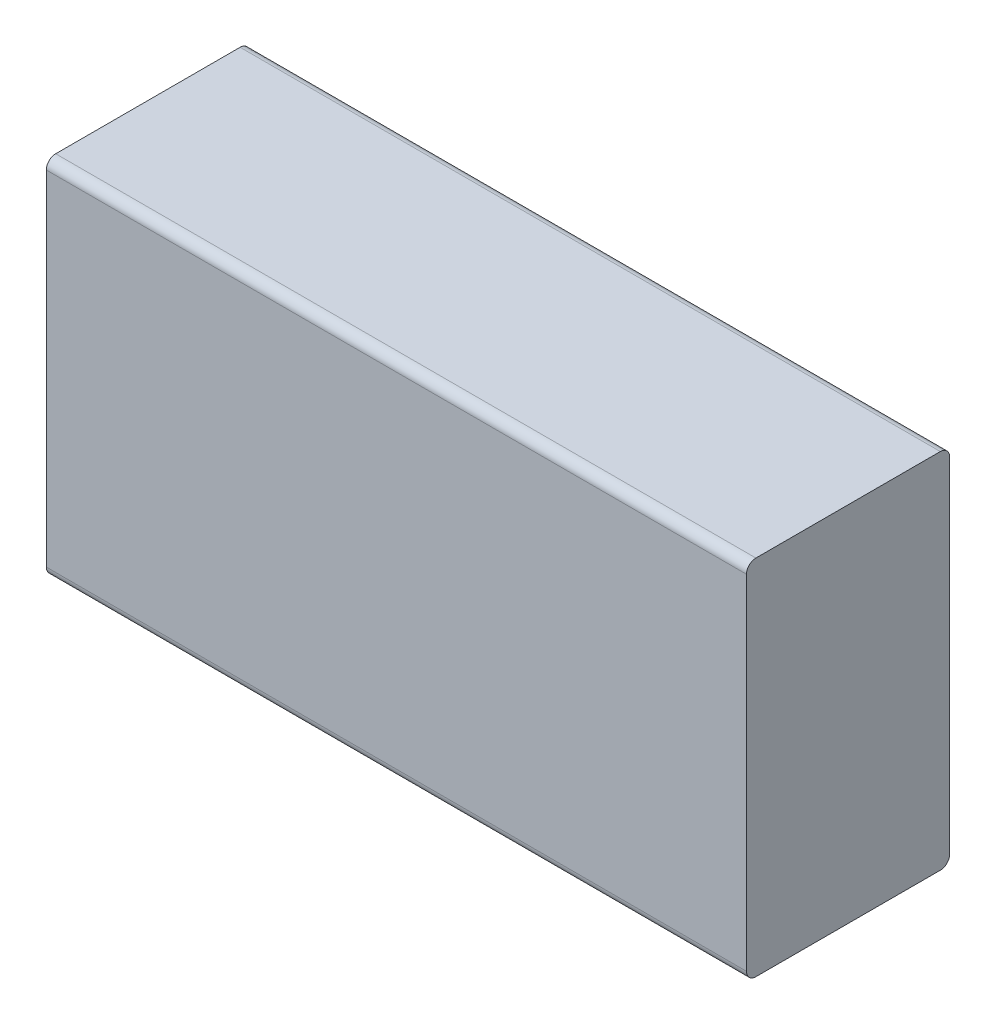
ISO-10303-21;
HEADER;
FILE_DESCRIPTION(('STEP AP214'),'2;1');
FILE_NAME('part.step','',(''),(''),'','','');
FILE_SCHEMA(('AUTOMOTIVE_DESIGN { 1 0 10303 214 1 1 1 1 }'));
ENDSEC;
DATA;
#1=APPLICATION_CONTEXT('core data for automotive mechanical design processes');
#2=APPLICATION_PROTOCOL_DEFINITION('international standard','automotive_design',2000,#1);
#3=PRODUCT_CONTEXT('',#1,'mechanical');
#4=PRODUCT('Part','Part','',(#3));
#5=PRODUCT_RELATED_PRODUCT_CATEGORY('part','',(#4));
#6=PRODUCT_DEFINITION_FORMATION('','',#4);
#7=PRODUCT_DEFINITION_CONTEXT('part definition',#1,'design');
#8=PRODUCT_DEFINITION('design','',#6,#7);
#9=PRODUCT_DEFINITION_SHAPE('','',#8);
#10=(LENGTH_UNIT() NAMED_UNIT(*) SI_UNIT(.MILLI.,.METRE.));
#11=(NAMED_UNIT(*) PLANE_ANGLE_UNIT() SI_UNIT($,.RADIAN.));
#12=(NAMED_UNIT(*) SI_UNIT($,.STERADIAN.) SOLID_ANGLE_UNIT());
#13=UNCERTAINTY_MEASURE_WITH_UNIT(LENGTH_MEASURE(1.E-05),#10,'distance_accuracy_value','');
#14=(GEOMETRIC_REPRESENTATION_CONTEXT(3) GLOBAL_UNCERTAINTY_ASSIGNED_CONTEXT((#13)) GLOBAL_UNIT_ASSIGNED_CONTEXT((#10,
#11,#12)) REPRESENTATION_CONTEXT('',''));
#15=CARTESIAN_POINT('',(0.,0.,0.));
#16=DIRECTION('',(0.,0.,1.));
#17=DIRECTION('',(1.,0.,0.));
#18=AXIS2_PLACEMENT_3D('',#15,#16,#17);
#19=CARTESIAN_POINT('',(168.,3.,29.5));
#20=DIRECTION('',(-1.,0.,0.));
#21=DIRECTION('',(0.,0.,1.));
#22=AXIS2_PLACEMENT_3D('',#19,#20,#21);
#23=CYLINDRICAL_SURFACE('',#22,3.);
#24=CARTESIAN_POINT('',(224.,3.,29.5));
#25=DIRECTION('',(-1.,0.,0.));
#26=DIRECTION('',(0.,0.,1.));
#27=AXIS2_PLACEMENT_3D('',#24,#25,#26);
#28=CIRCLE('',#27,3.);
#29=CARTESIAN_POINT('',(224.,3.00000000000001,32.5));
#30=VERTEX_POINT('',#29);
#31=CARTESIAN_POINT('',(224.,0.,29.5));
#32=VERTEX_POINT('',#31);
#33=EDGE_CURVE('E104',#30,#32,#28,.F.);
#34=ORIENTED_EDGE('',*,*,#33,.F.);
#35=DIRECTION('',(1.,0.,0.));
#36=VECTOR('',#35,1.);
#37=CARTESIAN_POINT('',(112.,3.00000000000001,32.5));
#38=LINE('',#37,#36);
#39=CARTESIAN_POINT('',(0.,3.,32.5));
#40=VERTEX_POINT('',#39);
#41=EDGE_CURVE('E93',#40,#30,#38,.T.);
#42=ORIENTED_EDGE('',*,*,#41,.F.);
#43=CARTESIAN_POINT('',(0.,3.,29.5));
#44=DIRECTION('',(-1.,0.,0.));
#45=DIRECTION('',(0.,0.,1.));
#46=AXIS2_PLACEMENT_3D('',#43,#44,#45);
#47=CIRCLE('',#46,3.);
#48=CARTESIAN_POINT('',(0.,0.,29.5));
#49=VERTEX_POINT('',#48);
#50=EDGE_CURVE('E130',#49,#40,#47,.T.);
#51=ORIENTED_EDGE('',*,*,#50,.F.);
#52=DIRECTION('',(1.,0.,0.));
#53=VECTOR('',#52,1.);
#54=CARTESIAN_POINT('',(224.,0.,29.5));
#55=LINE('',#54,#53);
#56=EDGE_CURVE('E111',#32,#49,#55,.F.);
#57=ORIENTED_EDGE('',*,*,#56,.F.);
#58=EDGE_LOOP('',(#34,#42,#51,#57));
#59=FACE_BOUND('',#58,.T.);
#60=ADVANCED_FACE('F17',(#59),#23,.T.);
#61=CARTESIAN_POINT('',(112.,58.,32.5));
#62=DIRECTION('',(0.,0.,1.));
#63=DIRECTION('',(1.,0.,0.));
#64=AXIS2_PLACEMENT_3D('',#61,#62,#63);
#65=PLANE('',#64);
#66=ORIENTED_EDGE('',*,*,#41,.T.);
#67=DIRECTION('',(0.,1.,0.));
#68=VECTOR('',#67,1.);
#69=CARTESIAN_POINT('',(224.,116.,32.5));
#70=LINE('',#69,#68);
#71=CARTESIAN_POINT('',(224.,113.,32.5));
#72=VERTEX_POINT('',#71);
#73=EDGE_CURVE('E98',#72,#30,#70,.F.);
#74=ORIENTED_EDGE('',*,*,#73,.F.);
#75=DIRECTION('',(1.,0.,0.));
#76=VECTOR('',#75,1.);
#77=CARTESIAN_POINT('',(56.,113.,32.5));
#78=LINE('',#77,#76);
#79=CARTESIAN_POINT('',(0.,113.,32.5));
#80=VERTEX_POINT('',#79);
#81=EDGE_CURVE('E86',#80,#72,#78,.T.);
#82=ORIENTED_EDGE('',*,*,#81,.F.);
#83=DIRECTION('',(0.,1.,0.));
#84=VECTOR('',#83,1.);
#85=CARTESIAN_POINT('',(0.,0.,32.5));
#86=LINE('',#85,#84);
#87=EDGE_CURVE('E129',#40,#80,#86,.T.);
#88=ORIENTED_EDGE('',*,*,#87,.F.);
#89=EDGE_LOOP('',(#66,#74,#82,#88));
#90=FACE_BOUND('',#89,.T.);
#91=ADVANCED_FACE('F102',(#90),#65,.T.);
#92=CARTESIAN_POINT('',(56.,113.,29.5));
#93=DIRECTION('',(1.,0.,0.));
#94=DIRECTION('',(0.,1.,0.));
#95=AXIS2_PLACEMENT_3D('',#92,#93,#94);
#96=CYLINDRICAL_SURFACE('',#95,3.);
#97=CARTESIAN_POINT('',(0.,113.,29.5));
#98=DIRECTION('',(1.,0.,0.));
#99=DIRECTION('',(0.,1.,0.));
#100=AXIS2_PLACEMENT_3D('',#97,#98,#99);
#101=CIRCLE('',#100,3.);
#102=CARTESIAN_POINT('',(0.,116.,29.5));
#103=VERTEX_POINT('',#102);
#104=EDGE_CURVE('E89',#80,#103,#101,.F.);
#105=ORIENTED_EDGE('',*,*,#104,.F.);
#106=ORIENTED_EDGE('',*,*,#81,.T.);
#107=CARTESIAN_POINT('',(224.,113.,29.5));
#108=DIRECTION('',(1.,0.,0.));
#109=DIRECTION('',(0.,1.,0.));
#110=AXIS2_PLACEMENT_3D('',#107,#108,#109);
#111=CIRCLE('',#110,3.);
#112=CARTESIAN_POINT('',(224.,116.,29.5));
#113=VERTEX_POINT('',#112);
#114=EDGE_CURVE('E20',#113,#72,#111,.T.);
#115=ORIENTED_EDGE('',*,*,#114,.F.);
#116=DIRECTION('',(1.,0.,0.));
#117=VECTOR('',#116,1.);
#118=CARTESIAN_POINT('',(0.,116.,29.5));
#119=LINE('',#118,#117);
#120=EDGE_CURVE('E79',#103,#113,#119,.T.);
#121=ORIENTED_EDGE('',*,*,#120,.F.);
#122=EDGE_LOOP('',(#105,#106,#115,#121));
#123=FACE_BOUND('',#122,.T.);
#124=ADVANCED_FACE('F88',(#123),#96,.T.);
#125=CARTESIAN_POINT('',(0.,116.,0.));
#126=DIRECTION('',(0.,1.,0.));
#127=DIRECTION('',(0.,0.,1.));
#128=AXIS2_PLACEMENT_3D('',#125,#126,#127);
#129=PLANE('',#128);
#130=ORIENTED_EDGE('',*,*,#120,.T.);
#131=DIRECTION('',(0.,0.,-1.));
#132=VECTOR('',#131,1.);
#133=CARTESIAN_POINT('',(224.,116.,0.));
#134=LINE('',#133,#132);
#135=CARTESIAN_POINT('',(224.,116.,-29.5));
#136=VERTEX_POINT('',#135);
#137=EDGE_CURVE('E101',#136,#113,#134,.F.);
#138=ORIENTED_EDGE('',*,*,#137,.F.);
#139=DIRECTION('',(-1.,0.,0.));
#140=VECTOR('',#139,1.);
#141=CARTESIAN_POINT('',(56.,116.,-29.5));
#142=LINE('',#141,#140);
#143=CARTESIAN_POINT('',(0.,116.,-29.5));
#144=VERTEX_POINT('',#143);
#145=EDGE_CURVE('E115',#144,#136,#142,.F.);
#146=ORIENTED_EDGE('',*,*,#145,.F.);
#147=DIRECTION('',(0.,0.,1.));
#148=VECTOR('',#147,1.);
#149=CARTESIAN_POINT('',(0.,116.,0.));
#150=LINE('',#149,#148);
#151=EDGE_CURVE('E127',#103,#144,#150,.F.);
#152=ORIENTED_EDGE('',*,*,#151,.F.);
#153=EDGE_LOOP('',(#130,#138,#146,#152));
#154=FACE_BOUND('',#153,.T.);
#155=ADVANCED_FACE('F156',(#154),#129,.T.);
#156=CARTESIAN_POINT('',(224.,0.,0.));
#157=DIRECTION('',(0.,-1.,0.));
#158=DIRECTION('',(0.,0.,-1.));
#159=AXIS2_PLACEMENT_3D('',#156,#157,#158);
#160=PLANE('',#159);
#161=ORIENTED_EDGE('',*,*,#56,.T.);
#162=DIRECTION('',(0.,0.,1.));
#163=VECTOR('',#162,1.);
#164=CARTESIAN_POINT('',(0.,0.,0.));
#165=LINE('',#164,#163);
#166=CARTESIAN_POINT('',(0.,0.,-29.5));
#167=VERTEX_POINT('',#166);
#168=EDGE_CURVE('E132',#167,#49,#165,.T.);
#169=ORIENTED_EDGE('',*,*,#168,.F.);
#170=DIRECTION('',(1.,0.,0.));
#171=VECTOR('',#170,1.);
#172=CARTESIAN_POINT('',(168.,0.,-29.5));
#173=LINE('',#172,#171);
#174=CARTESIAN_POINT('',(224.,0.,-29.5));
#175=VERTEX_POINT('',#174);
#176=EDGE_CURVE('E112',#175,#167,#173,.F.);
#177=ORIENTED_EDGE('',*,*,#176,.F.);
#178=DIRECTION('',(0.,0.,-1.));
#179=VECTOR('',#178,1.);
#180=CARTESIAN_POINT('',(224.,0.,0.));
#181=LINE('',#180,#179);
#182=EDGE_CURVE('E106',#32,#175,#181,.T.);
#183=ORIENTED_EDGE('',*,*,#182,.F.);
#184=EDGE_LOOP('',(#161,#169,#177,#183));
#185=FACE_BOUND('',#184,.T.);
#186=ADVANCED_FACE('F158',(#185),#160,.T.);
#187=CARTESIAN_POINT('',(224.,116.,0.));
#188=DIRECTION('',(1.,0.,0.));
#189=DIRECTION('',(0.,0.,-1.));
#190=AXIS2_PLACEMENT_3D('',#187,#188,#189);
#191=PLANE('',#190);
#192=ORIENTED_EDGE('',*,*,#33,.T.);
#193=ORIENTED_EDGE('',*,*,#182,.T.);
#194=CARTESIAN_POINT('',(224.,3.,-29.5));
#195=DIRECTION('',(1.,0.,0.));
#196=DIRECTION('',(0.,0.,-1.));
#197=AXIS2_PLACEMENT_3D('',#194,#195,#196);
#198=CIRCLE('',#197,3.);
#199=CARTESIAN_POINT('',(224.,3.,-32.5));
#200=VERTEX_POINT('',#199);
#201=EDGE_CURVE('E114',#200,#175,#198,.F.);
#202=ORIENTED_EDGE('',*,*,#201,.F.);
#203=DIRECTION('',(0.,1.,0.));
#204=VECTOR('',#203,1.);
#205=CARTESIAN_POINT('',(224.,58.,-32.5));
#206=LINE('',#205,#204);
#207=CARTESIAN_POINT('',(224.,113.,-32.5));
#208=VERTEX_POINT('',#207);
#209=EDGE_CURVE('E122',#200,#208,#206,.T.);
#210=ORIENTED_EDGE('',*,*,#209,.T.);
#211=CARTESIAN_POINT('',(224.,113.,-29.5));
#212=DIRECTION('',(-1.,0.,0.));
#213=DIRECTION('',(0.,-1.,0.));
#214=AXIS2_PLACEMENT_3D('',#211,#212,#213);
#215=CIRCLE('',#214,3.);
#216=EDGE_CURVE('E117',#136,#208,#215,.T.);
#217=ORIENTED_EDGE('',*,*,#216,.F.);
#218=ORIENTED_EDGE('',*,*,#137,.T.);
#219=ORIENTED_EDGE('',*,*,#114,.T.);
#220=ORIENTED_EDGE('',*,*,#73,.T.);
#221=EDGE_LOOP('',(#192,#193,#202,#210,#217,#218,#219,#220));
#222=FACE_BOUND('',#221,.T.);
#223=ADVANCED_FACE('F97',(#222),#191,.T.);
#224=CARTESIAN_POINT('',(56.,113.,-29.5));
#225=DIRECTION('',(-1.,0.,0.));
#226=DIRECTION('',(0.,-1.,0.));
#227=AXIS2_PLACEMENT_3D('',#224,#225,#226);
#228=CYLINDRICAL_SURFACE('',#227,3.);
#229=ORIENTED_EDGE('',*,*,#216,.T.);
#230=DIRECTION('',(1.,0.,0.));
#231=VECTOR('',#230,1.);
#232=CARTESIAN_POINT('',(112.,113.,-32.5));
#233=LINE('',#232,#231);
#234=CARTESIAN_POINT('',(0.,113.,-32.5));
#235=VERTEX_POINT('',#234);
#236=EDGE_CURVE('E144',#208,#235,#233,.F.);
#237=ORIENTED_EDGE('',*,*,#236,.T.);
#238=CARTESIAN_POINT('',(0.,113.,-29.5));
#239=DIRECTION('',(-1.,0.,0.));
#240=DIRECTION('',(0.,-1.,0.));
#241=AXIS2_PLACEMENT_3D('',#238,#239,#240);
#242=CIRCLE('',#241,3.);
#243=EDGE_CURVE('E125',#144,#235,#242,.T.);
#244=ORIENTED_EDGE('',*,*,#243,.F.);
#245=ORIENTED_EDGE('',*,*,#145,.T.);
#246=EDGE_LOOP('',(#229,#237,#244,#245));
#247=FACE_BOUND('',#246,.T.);
#248=ADVANCED_FACE('F153',(#247),#228,.T.);
#249=CARTESIAN_POINT('',(0.,0.,0.));
#250=DIRECTION('',(-1.,0.,0.));
#251=DIRECTION('',(0.,0.,1.));
#252=AXIS2_PLACEMENT_3D('',#249,#250,#251);
#253=PLANE('',#252);
#254=ORIENTED_EDGE('',*,*,#243,.T.);
#255=DIRECTION('',(0.,1.,0.));
#256=VECTOR('',#255,1.);
#257=CARTESIAN_POINT('',(0.,58.,-32.5));
#258=LINE('',#257,#256);
#259=CARTESIAN_POINT('',(0.,3.,-32.5));
#260=VERTEX_POINT('',#259);
#261=EDGE_CURVE('E26',#235,#260,#258,.F.);
#262=ORIENTED_EDGE('',*,*,#261,.T.);
#263=CARTESIAN_POINT('',(0.,3.,-29.5));
#264=DIRECTION('',(1.,0.,0.));
#265=DIRECTION('',(0.,0.,-1.));
#266=AXIS2_PLACEMENT_3D('',#263,#264,#265);
#267=CIRCLE('',#266,3.);
#268=EDGE_CURVE('E34',#167,#260,#267,.T.);
#269=ORIENTED_EDGE('',*,*,#268,.F.);
#270=ORIENTED_EDGE('',*,*,#168,.T.);
#271=ORIENTED_EDGE('',*,*,#50,.T.);
#272=ORIENTED_EDGE('',*,*,#87,.T.);
#273=ORIENTED_EDGE('',*,*,#104,.T.);
#274=ORIENTED_EDGE('',*,*,#151,.T.);
#275=EDGE_LOOP('',(#254,#262,#269,#270,#271,#272,#273,#274));
#276=FACE_BOUND('',#275,.T.);
#277=ADVANCED_FACE('F155',(#276),#253,.T.);
#278=CARTESIAN_POINT('',(168.,3.,-29.5));
#279=DIRECTION('',(1.,0.,0.));
#280=DIRECTION('',(0.,0.,-1.));
#281=AXIS2_PLACEMENT_3D('',#278,#279,#280);
#282=CYLINDRICAL_SURFACE('',#281,3.);
#283=ORIENTED_EDGE('',*,*,#268,.T.);
#284=DIRECTION('',(1.,0.,0.));
#285=VECTOR('',#284,1.);
#286=CARTESIAN_POINT('',(112.,3.00000000000001,-32.5));
#287=LINE('',#286,#285);
#288=EDGE_CURVE('E11',#260,#200,#287,.T.);
#289=ORIENTED_EDGE('',*,*,#288,.T.);
#290=ORIENTED_EDGE('',*,*,#201,.T.);
#291=ORIENTED_EDGE('',*,*,#176,.T.);
#292=EDGE_LOOP('',(#283,#289,#290,#291));
#293=FACE_BOUND('',#292,.T.);
#294=ADVANCED_FACE('F169',(#293),#282,.T.);
#295=CARTESIAN_POINT('',(112.,58.,-32.5));
#296=DIRECTION('',(0.,0.,1.));
#297=DIRECTION('',(1.,0.,0.));
#298=AXIS2_PLACEMENT_3D('',#295,#296,#297);
#299=PLANE('',#298);
#300=ORIENTED_EDGE('',*,*,#261,.F.);
#301=ORIENTED_EDGE('',*,*,#236,.F.);
#302=ORIENTED_EDGE('',*,*,#209,.F.);
#303=ORIENTED_EDGE('',*,*,#288,.F.);
#304=EDGE_LOOP('',(#300,#301,#302,#303));
#305=FACE_BOUND('',#304,.T.);
#306=ADVANCED_FACE('F151',(#305),#299,.F.);
#307=CLOSED_SHELL('',(#60,#91,#124,#155,#186,#223,#248,#277,#294,#306));
#308=MANIFOLD_SOLID_BREP('B1',#307);
#309=ADVANCED_BREP_SHAPE_REPRESENTATION('',(#18,#308),#14);
#310=SHAPE_DEFINITION_REPRESENTATION(#9,#309);
ENDSEC;
END-ISO-10303-21;
